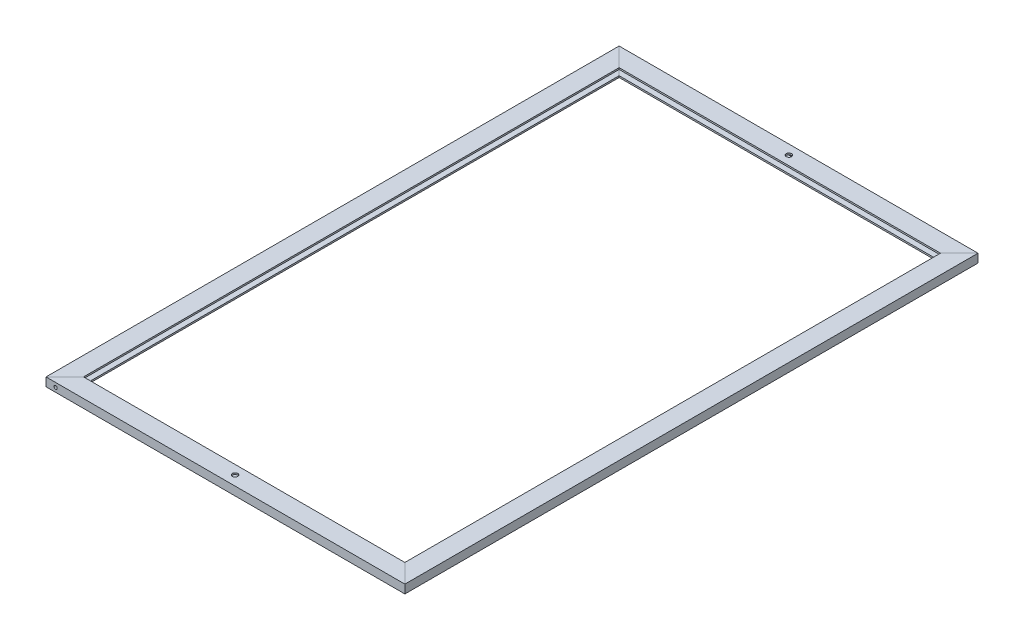
ISO-10303-21;
HEADER;
FILE_DESCRIPTION(('STEP AP214'),'2;1');
FILE_NAME('part.step','',(''),(''),'','','');
FILE_SCHEMA(('AUTOMOTIVE_DESIGN { 1 0 10303 214 1 1 1 1 }'));
ENDSEC;
DATA;
#1=APPLICATION_CONTEXT('core data for automotive mechanical design processes');
#2=APPLICATION_PROTOCOL_DEFINITION('international standard','automotive_design',2000,#1);
#3=PRODUCT_CONTEXT('',#1,'mechanical');
#4=PRODUCT('Part','Part','',(#3));
#5=PRODUCT_RELATED_PRODUCT_CATEGORY('part','',(#4));
#6=PRODUCT_DEFINITION_FORMATION('','',#4);
#7=PRODUCT_DEFINITION_CONTEXT('part definition',#1,'design');
#8=PRODUCT_DEFINITION('design','',#6,#7);
#9=PRODUCT_DEFINITION_SHAPE('','',#8);
#10=(LENGTH_UNIT() NAMED_UNIT(*) SI_UNIT(.MILLI.,.METRE.));
#11=(NAMED_UNIT(*) PLANE_ANGLE_UNIT() SI_UNIT($,.RADIAN.));
#12=(NAMED_UNIT(*) SI_UNIT($,.STERADIAN.) SOLID_ANGLE_UNIT());
#13=UNCERTAINTY_MEASURE_WITH_UNIT(LENGTH_MEASURE(1.E-05),#10,'distance_accuracy_value','');
#14=(GEOMETRIC_REPRESENTATION_CONTEXT(3) GLOBAL_UNCERTAINTY_ASSIGNED_CONTEXT((#13)) GLOBAL_UNIT_ASSIGNED_CONTEXT((#10,
#11,#12)) REPRESENTATION_CONTEXT('',''));
#15=CARTESIAN_POINT('',(0.,0.,0.));
#16=DIRECTION('',(0.,0.,1.));
#17=DIRECTION('',(1.,0.,0.));
#18=AXIS2_PLACEMENT_3D('',#15,#16,#17);
#19=CARTESIAN_POINT('',(630.,-3.,-1038.6));
#20=DIRECTION('',(0.,1.,0.));
#21=DIRECTION('',(-1.,0.,0.));
#22=AXIS2_PLACEMENT_3D('',#19,#20,#21);
#23=PLANE('',#22);
#24=DIRECTION('',(0.,0.,1.));
#25=VECTOR('',#24,1.);
#26=CARTESIAN_POINT('',(600.,-3.,-1038.6));
#27=LINE('',#26,#25);
#28=CARTESIAN_POINT('',(600.,-3.,-1000.));
#29=VERTEX_POINT('',#28);
#30=CARTESIAN_POINT('',(600.,-3.,0.));
#31=VERTEX_POINT('',#30);
#32=EDGE_CURVE('E41',#29,#31,#27,.T.);
#33=ORIENTED_EDGE('',*,*,#32,.F.);
#34=DIRECTION('',(0.707106781186548,0.,-0.707106781186548));
#35=VECTOR('',#34,1.);
#36=CARTESIAN_POINT('',(295.7,-3.00000000000001,-695.7));
#37=LINE('',#36,#35);
#38=CARTESIAN_POINT('',(630.,-3.,-1030.));
#39=VERTEX_POINT('',#38);
#40=EDGE_CURVE('E207',#29,#39,#37,.T.);
#41=ORIENTED_EDGE('',*,*,#40,.T.);
#42=DIRECTION('',(0.,0.,1.));
#43=VECTOR('',#42,1.);
#44=CARTESIAN_POINT('',(630.,-3.,-1038.6));
#45=LINE('',#44,#43);
#46=CARTESIAN_POINT('',(630.,-3.,30.));
#47=VERTEX_POINT('',#46);
#48=EDGE_CURVE('E141',#39,#47,#45,.T.);
#49=ORIENTED_EDGE('',*,*,#48,.T.);
#50=DIRECTION('',(0.707106781186548,0.,0.707106781186548));
#51=VECTOR('',#50,1.);
#52=CARTESIAN_POINT('',(634.3,-3.,34.2999999999999));
#53=LINE('',#52,#51);
#54=EDGE_CURVE('E128',#31,#47,#53,.T.);
#55=ORIENTED_EDGE('',*,*,#54,.F.);
#56=EDGE_LOOP('',(#33,#41,#49,#55));
#57=FACE_BOUND('',#56,.T.);
#58=ADVANCED_FACE('F38',(#57),#23,.F.);
#59=CARTESIAN_POINT('',(630.,-13.,-1038.6));
#60=DIRECTION('',(1.,0.,0.));
#61=DIRECTION('',(0.,0.,-1.));
#62=AXIS2_PLACEMENT_3D('',#59,#60,#61);
#63=PLANE('',#62);
#64=ORIENTED_EDGE('',*,*,#48,.F.);
#65=DIRECTION('',(0.,-1.,0.));
#66=VECTOR('',#65,1.);
#67=CARTESIAN_POINT('',(630.,-13.,-1030.));
#68=LINE('',#67,#66);
#69=CARTESIAN_POINT('',(630.,-13.,-1030.));
#70=VERTEX_POINT('',#69);
#71=EDGE_CURVE('E272',#39,#70,#68,.T.);
#72=ORIENTED_EDGE('',*,*,#71,.T.);
#73=DIRECTION('',(0.,0.,1.));
#74=VECTOR('',#73,1.);
#75=CARTESIAN_POINT('',(630.,-13.,-1038.6));
#76=LINE('',#75,#74);
#77=CARTESIAN_POINT('',(630.,-13.,29.9999999999998));
#78=VERTEX_POINT('',#77);
#79=EDGE_CURVE('E161',#70,#78,#76,.T.);
#80=ORIENTED_EDGE('',*,*,#79,.T.);
#81=DIRECTION('',(0.,-1.,0.));
#82=VECTOR('',#81,1.);
#83=CARTESIAN_POINT('',(630.,-13.,29.9999999999999));
#84=LINE('',#83,#82);
#85=EDGE_CURVE('E145',#47,#78,#84,.T.);
#86=ORIENTED_EDGE('',*,*,#85,.F.);
#87=EDGE_LOOP('',(#64,#72,#80,#86));
#88=FACE_BOUND('',#87,.T.);
#89=ADVANCED_FACE('F391',(#88),#63,.F.);
#90=CARTESIAN_POINT('',(600.,-13.,-1038.6));
#91=DIRECTION('',(0.,-1.,0.));
#92=DIRECTION('',(1.,0.,0.));
#93=AXIS2_PLACEMENT_3D('',#90,#91,#92);
#94=PLANE('',#93);
#95=ORIENTED_EDGE('',*,*,#79,.F.);
#96=DIRECTION('',(-0.707106781186548,0.,0.707106781186548));
#97=VECTOR('',#96,1.);
#98=CARTESIAN_POINT('',(280.7,-13.,-680.7));
#99=LINE('',#98,#97);
#100=CARTESIAN_POINT('',(600.,-13.,-1000.));
#101=VERTEX_POINT('',#100);
#102=EDGE_CURVE('E269',#70,#101,#99,.T.);
#103=ORIENTED_EDGE('',*,*,#102,.T.);
#104=DIRECTION('',(0.,0.,1.));
#105=VECTOR('',#104,1.);
#106=CARTESIAN_POINT('',(600.,-13.,-1038.6));
#107=LINE('',#106,#105);
#108=CARTESIAN_POINT('',(600.,-13.,0.));
#109=VERTEX_POINT('',#108);
#110=EDGE_CURVE('E165',#101,#109,#107,.T.);
#111=ORIENTED_EDGE('',*,*,#110,.T.);
#112=DIRECTION('',(-0.707106781186548,0.,-0.707106781186548));
#113=VECTOR('',#112,1.);
#114=CARTESIAN_POINT('',(619.3,-13.,19.2999999999999));
#115=LINE('',#114,#113);
#116=EDGE_CURVE('E215',#78,#109,#115,.T.);
#117=ORIENTED_EDGE('',*,*,#116,.F.);
#118=EDGE_LOOP('',(#95,#103,#111,#117));
#119=FACE_BOUND('',#118,.T.);
#120=ADVANCED_FACE('F389',(#119),#94,.F.);
#121=CARTESIAN_POINT('',(600.,-16.,-1038.6));
#122=DIRECTION('',(1.,0.,0.));
#123=DIRECTION('',(0.,1.,0.));
#124=AXIS2_PLACEMENT_3D('',#121,#122,#123);
#125=PLANE('',#124);
#126=ORIENTED_EDGE('',*,*,#110,.F.);
#127=DIRECTION('',(0.,-1.,0.));
#128=VECTOR('',#127,1.);
#129=CARTESIAN_POINT('',(600.,-16.,-1000.));
#130=LINE('',#129,#128);
#131=CARTESIAN_POINT('',(600.,-16.,-1000.));
#132=VERTEX_POINT('',#131);
#133=EDGE_CURVE('E266',#101,#132,#130,.T.);
#134=ORIENTED_EDGE('',*,*,#133,.T.);
#135=DIRECTION('',(0.,0.,1.));
#136=VECTOR('',#135,1.);
#137=CARTESIAN_POINT('',(600.,-16.,-1038.6));
#138=LINE('',#137,#136);
#139=CARTESIAN_POINT('',(600.,-16.,-1.35308431126191E-13));
#140=VERTEX_POINT('',#139);
#141=EDGE_CURVE('E168',#132,#140,#138,.T.);
#142=ORIENTED_EDGE('',*,*,#141,.T.);
#143=DIRECTION('',(0.,-1.,0.));
#144=VECTOR('',#143,1.);
#145=CARTESIAN_POINT('',(600.,-16.,-1.11022302462516E-13));
#146=LINE('',#145,#144);
#147=EDGE_CURVE('E213',#109,#140,#146,.T.);
#148=ORIENTED_EDGE('',*,*,#147,.F.);
#149=EDGE_LOOP('',(#126,#134,#142,#148));
#150=FACE_BOUND('',#149,.T.);
#151=ADVANCED_FACE('F397',(#150),#125,.F.);
#152=CARTESIAN_POINT('',(635.,-16.,-1038.6));
#153=DIRECTION('',(0.,1.,0.));
#154=DIRECTION('',(0.,0.,1.));
#155=AXIS2_PLACEMENT_3D('',#152,#153,#154);
#156=PLANE('',#155);
#157=ORIENTED_EDGE('',*,*,#141,.F.);
#158=DIRECTION('',(0.707106781186548,0.,-0.707106781186548));
#159=VECTOR('',#158,1.);
#160=CARTESIAN_POINT('',(298.2,-16.,-698.2));
#161=LINE('',#160,#159);
#162=CARTESIAN_POINT('',(635.,-16.,-1035.));
#163=VERTEX_POINT('',#162);
#164=EDGE_CURVE('E263',#132,#163,#161,.T.);
#165=ORIENTED_EDGE('',*,*,#164,.T.);
#166=DIRECTION('',(0.,0.,1.));
#167=VECTOR('',#166,1.);
#168=CARTESIAN_POINT('',(635.,-16.,-1038.6));
#169=LINE('',#168,#167);
#170=CARTESIAN_POINT('',(635.,-16.,34.9999999999999));
#171=VERTEX_POINT('',#170);
#172=EDGE_CURVE('E171',#163,#171,#169,.T.);
#173=ORIENTED_EDGE('',*,*,#172,.T.);
#174=DIRECTION('',(0.707106781186548,0.,0.707106781186548));
#175=VECTOR('',#174,1.);
#176=CARTESIAN_POINT('',(636.8,-16.,36.7999999999999));
#177=LINE('',#176,#175);
#178=EDGE_CURVE('E211',#140,#171,#177,.T.);
#179=ORIENTED_EDGE('',*,*,#178,.F.);
#180=EDGE_LOOP('',(#157,#165,#173,#179));
#181=FACE_BOUND('',#180,.T.);
#182=ADVANCED_FACE('F472',(#181),#156,.F.);
#183=CARTESIAN_POINT('',(635.,0.,-1038.6));
#184=DIRECTION('',(-1.,0.,0.));
#185=DIRECTION('',(0.,0.,1.));
#186=AXIS2_PLACEMENT_3D('',#183,#184,#185);
#187=PLANE('',#186);
#188=ORIENTED_EDGE('',*,*,#172,.F.);
#189=DIRECTION('',(0.,1.,0.));
#190=VECTOR('',#189,1.);
#191=CARTESIAN_POINT('',(635.,0.,-1035.));
#192=LINE('',#191,#190);
#193=CARTESIAN_POINT('',(635.,0.,-1035.));
#194=VERTEX_POINT('',#193);
#195=EDGE_CURVE('E188',#163,#194,#192,.T.);
#196=ORIENTED_EDGE('',*,*,#195,.T.);
#197=DIRECTION('',(0.,0.,1.));
#198=VECTOR('',#197,1.);
#199=CARTESIAN_POINT('',(635.,0.,-1038.6));
#200=LINE('',#199,#198);
#201=CARTESIAN_POINT('',(635.,0.,34.9999999999998));
#202=VERTEX_POINT('',#201);
#203=EDGE_CURVE('E174',#194,#202,#200,.T.);
#204=ORIENTED_EDGE('',*,*,#203,.T.);
#205=DIRECTION('',(0.,1.,0.));
#206=VECTOR('',#205,1.);
#207=CARTESIAN_POINT('',(635.,0.,34.9999999999999));
#208=LINE('',#207,#206);
#209=EDGE_CURVE('E110',#171,#202,#208,.T.);
#210=ORIENTED_EDGE('',*,*,#209,.F.);
#211=EDGE_LOOP('',(#188,#196,#204,#210));
#212=FACE_BOUND('',#211,.T.);
#213=ADVANCED_FACE('F469',(#212),#187,.F.);
#214=CARTESIAN_POINT('',(600.,0.,-1038.6));
#215=DIRECTION('',(0.,-1.,0.));
#216=DIRECTION('',(1.,0.,0.));
#217=AXIS2_PLACEMENT_3D('',#214,#215,#216);
#218=PLANE('',#217);
#219=ORIENTED_EDGE('',*,*,#203,.F.);
#220=DIRECTION('',(-0.707106781186548,0.,0.707106781186548));
#221=VECTOR('',#220,1.);
#222=CARTESIAN_POINT('',(280.7,0.,-680.7));
#223=LINE('',#222,#221);
#224=CARTESIAN_POINT('',(600.,0.,-1000.));
#225=VERTEX_POINT('',#224);
#226=EDGE_CURVE('E183',#194,#225,#223,.T.);
#227=ORIENTED_EDGE('',*,*,#226,.T.);
#228=DIRECTION('',(0.,0.,1.));
#229=VECTOR('',#228,1.);
#230=CARTESIAN_POINT('',(600.,0.,-1038.6));
#231=LINE('',#230,#229);
#232=CARTESIAN_POINT('',(600.,0.,0.));
#233=VERTEX_POINT('',#232);
#234=EDGE_CURVE('E138',#225,#233,#231,.T.);
#235=ORIENTED_EDGE('',*,*,#234,.T.);
#236=DIRECTION('',(-0.707106781186548,0.,-0.707106781186548));
#237=VECTOR('',#236,1.);
#238=CARTESIAN_POINT('',(619.3,0.,19.2999999999999));
#239=LINE('',#238,#237);
#240=EDGE_CURVE('E181',#202,#233,#239,.T.);
#241=ORIENTED_EDGE('',*,*,#240,.F.);
#242=EDGE_LOOP('',(#219,#227,#235,#241));
#243=FACE_BOUND('',#242,.T.);
#244=ADVANCED_FACE('F180',(#243),#218,.F.);
#245=CARTESIAN_POINT('',(600.,-3.,-1038.6));
#246=DIRECTION('',(1.,0.,0.));
#247=DIRECTION('',(0.,0.,-1.));
#248=AXIS2_PLACEMENT_3D('',#245,#246,#247);
#249=PLANE('',#248);
#250=ORIENTED_EDGE('',*,*,#234,.F.);
#251=DIRECTION('',(0.,-1.,0.));
#252=VECTOR('',#251,1.);
#253=CARTESIAN_POINT('',(600.,-3.,-1000.));
#254=LINE('',#253,#252);
#255=EDGE_CURVE('E134',#225,#29,#254,.T.);
#256=ORIENTED_EDGE('',*,*,#255,.T.);
#257=ORIENTED_EDGE('',*,*,#32,.T.);
#258=DIRECTION('',(0.,-1.,0.));
#259=VECTOR('',#258,1.);
#260=CARTESIAN_POINT('',(600.,-3.,-1.11022302462516E-13));
#261=LINE('',#260,#259);
#262=EDGE_CURVE('E117',#233,#31,#261,.T.);
#263=ORIENTED_EDGE('',*,*,#262,.F.);
#264=EDGE_LOOP('',(#250,#256,#257,#263));
#265=FACE_BOUND('',#264,.T.);
#266=ADVANCED_FACE('F133',(#265),#249,.F.);
#267=CARTESIAN_POINT('',(638.6,-3.,29.9999999999999));
#268=DIRECTION('',(0.,1.,0.));
#269=DIRECTION('',(0.,0.,1.));
#270=AXIS2_PLACEMENT_3D('',#267,#268,#269);
#271=PLANE('',#270);
#272=CARTESIAN_POINT('',(300.,-3.,16.9999999999999));
#273=DIRECTION('',(0.,1.,0.));
#274=DIRECTION('',(0.,0.,1.));
#275=AXIS2_PLACEMENT_3D('',#272,#273,#274);
#276=CIRCLE('',#275,4.99999999999999);
#277=CARTESIAN_POINT('',(300.,-3.,21.9999999999999));
#278=VERTEX_POINT('',#277);
#279=EDGE_CURVE('E503',#278,#278,#276,.T.);
#280=ORIENTED_EDGE('',*,*,#279,.T.);
#281=EDGE_LOOP('',(#280));
#282=FACE_BOUND('',#281,.T.);
#283=DIRECTION('',(-1.,0.,0.));
#284=VECTOR('',#283,1.);
#285=CARTESIAN_POINT('',(638.6,-3.,-1.11022302462516E-13));
#286=LINE('',#285,#284);
#287=CARTESIAN_POINT('',(0.,-3.,0.));
#288=VERTEX_POINT('',#287);
#289=EDGE_CURVE('E122',#31,#288,#286,.T.);
#290=ORIENTED_EDGE('',*,*,#289,.F.);
#291=ORIENTED_EDGE('',*,*,#54,.T.);
#292=DIRECTION('',(-1.,0.,0.));
#293=VECTOR('',#292,1.);
#294=CARTESIAN_POINT('',(638.6,-3.,29.9999999999999));
#295=LINE('',#294,#293);
#296=CARTESIAN_POINT('',(-30.,-3.,29.9999999999999));
#297=VERTEX_POINT('',#296);
#298=EDGE_CURVE('E209',#47,#297,#295,.T.);
#299=ORIENTED_EDGE('',*,*,#298,.T.);
#300=DIRECTION('',(-0.707106781186548,0.,0.707106781186548));
#301=VECTOR('',#300,1.);
#302=CARTESIAN_POINT('',(-34.3,-3.,34.3));
#303=LINE('',#302,#301);
#304=EDGE_CURVE('E149',#288,#297,#303,.T.);
#305=ORIENTED_EDGE('',*,*,#304,.F.);
#306=EDGE_LOOP('',(#290,#291,#299,#305));
#307=FACE_BOUND('',#306,.T.);
#308=ADVANCED_FACE('F147',(#282,#307),#271,.F.);
#309=CARTESIAN_POINT('',(638.6,-13.,29.9999999999999));
#310=DIRECTION('',(0.,0.,1.));
#311=DIRECTION('',(1.,0.,0.));
#312=AXIS2_PLACEMENT_3D('',#309,#310,#311);
#313=PLANE('',#312);
#314=CARTESIAN_POINT('',(-17.,-8.,29.9999999999998));
#315=DIRECTION('',(0.,0.,1.));
#316=DIRECTION('',(1.,0.,0.));
#317=AXIS2_PLACEMENT_3D('',#314,#315,#316);
#318=CIRCLE('',#317,3.);
#319=CARTESIAN_POINT('',(-14.,-8.,29.9999999999998));
#320=VERTEX_POINT('',#319);
#321=EDGE_CURVE('E162',#320,#320,#318,.T.);
#322=ORIENTED_EDGE('',*,*,#321,.T.);
#323=EDGE_LOOP('',(#322));
#324=FACE_BOUND('',#323,.T.);
#325=ORIENTED_EDGE('',*,*,#298,.F.);
#326=ORIENTED_EDGE('',*,*,#85,.T.);
#327=DIRECTION('',(-1.,0.,0.));
#328=VECTOR('',#327,1.);
#329=CARTESIAN_POINT('',(638.6,-13.,29.9999999999999));
#330=LINE('',#329,#328);
#331=CARTESIAN_POINT('',(-29.9999999999999,-13.,29.9999999999999));
#332=VERTEX_POINT('',#331);
#333=EDGE_CURVE('E219',#78,#332,#330,.T.);
#334=ORIENTED_EDGE('',*,*,#333,.T.);
#335=DIRECTION('',(0.,-1.,0.));
#336=VECTOR('',#335,1.);
#337=CARTESIAN_POINT('',(-30.,-13.,30.));
#338=LINE('',#337,#336);
#339=EDGE_CURVE('E368',#297,#332,#338,.T.);
#340=ORIENTED_EDGE('',*,*,#339,.F.);
#341=EDGE_LOOP('',(#325,#326,#334,#340));
#342=FACE_BOUND('',#341,.T.);
#343=ADVANCED_FACE('F374',(#324,#342),#313,.F.);
#344=CARTESIAN_POINT('',(638.6,-13.,-1.11022302462516E-13));
#345=DIRECTION('',(0.,-1.,0.));
#346=DIRECTION('',(0.,0.,-1.));
#347=AXIS2_PLACEMENT_3D('',#344,#345,#346);
#348=PLANE('',#347);
#349=CARTESIAN_POINT('',(300.,-13.,16.9999999999999));
#350=DIRECTION('',(0.,-1.,0.));
#351=DIRECTION('',(0.,0.,-1.));
#352=AXIS2_PLACEMENT_3D('',#349,#350,#351);
#353=CIRCLE('',#352,4.99999999999999);
#354=CARTESIAN_POINT('',(300.,-13.,11.9999999999999));
#355=VERTEX_POINT('',#354);
#356=EDGE_CURVE('E508',#355,#355,#353,.T.);
#357=ORIENTED_EDGE('',*,*,#356,.T.);
#358=EDGE_LOOP('',(#357));
#359=FACE_BOUND('',#358,.T.);
#360=ORIENTED_EDGE('',*,*,#333,.F.);
#361=ORIENTED_EDGE('',*,*,#116,.T.);
#362=DIRECTION('',(-1.,0.,0.));
#363=VECTOR('',#362,1.);
#364=CARTESIAN_POINT('',(638.6,-13.,-1.11022302462516E-13));
#365=LINE('',#364,#363);
#366=CARTESIAN_POINT('',(0.,-13.,0.));
#367=VERTEX_POINT('',#366);
#368=EDGE_CURVE('E222',#109,#367,#365,.T.);
#369=ORIENTED_EDGE('',*,*,#368,.T.);
#370=DIRECTION('',(0.707106781186548,0.,-0.707106781186548));
#371=VECTOR('',#370,1.);
#372=CARTESIAN_POINT('',(-19.3,-13.,19.3));
#373=LINE('',#372,#371);
#374=EDGE_CURVE('E371',#332,#367,#373,.T.);
#375=ORIENTED_EDGE('',*,*,#374,.F.);
#376=EDGE_LOOP('',(#360,#361,#369,#375));
#377=FACE_BOUND('',#376,.T.);
#378=ADVANCED_FACE('F376',(#359,#377),#348,.F.);
#379=CARTESIAN_POINT('',(638.6,-16.,-1.11022302462516E-13));
#380=DIRECTION('',(0.,0.,1.));
#381=DIRECTION('',(0.,-1.,0.));
#382=AXIS2_PLACEMENT_3D('',#379,#380,#381);
#383=PLANE('',#382);
#384=ORIENTED_EDGE('',*,*,#368,.F.);
#385=ORIENTED_EDGE('',*,*,#147,.T.);
#386=DIRECTION('',(-1.,0.,0.));
#387=VECTOR('',#386,1.);
#388=CARTESIAN_POINT('',(638.6,-16.,-1.11022302462516E-13));
#389=LINE('',#388,#387);
#390=CARTESIAN_POINT('',(0.,-16.,0.));
#391=VERTEX_POINT('',#390);
#392=EDGE_CURVE('E225',#140,#391,#389,.T.);
#393=ORIENTED_EDGE('',*,*,#392,.T.);
#394=DIRECTION('',(0.,-1.,0.));
#395=VECTOR('',#394,1.);
#396=CARTESIAN_POINT('',(0.,-16.,0.));
#397=LINE('',#396,#395);
#398=EDGE_CURVE('E354',#367,#391,#397,.T.);
#399=ORIENTED_EDGE('',*,*,#398,.F.);
#400=EDGE_LOOP('',(#384,#385,#393,#399));
#401=FACE_BOUND('',#400,.T.);
#402=ADVANCED_FACE('F451',(#401),#383,.F.);
#403=CARTESIAN_POINT('',(638.6,-16.,34.9999999999999));
#404=DIRECTION('',(0.,1.,0.));
#405=DIRECTION('',(0.,0.,1.));
#406=AXIS2_PLACEMENT_3D('',#403,#404,#405);
#407=PLANE('',#406);
#408=CARTESIAN_POINT('',(300.,-16.,16.9999999999999));
#409=DIRECTION('',(0.,1.,0.));
#410=DIRECTION('',(0.,0.,-1.));
#411=AXIS2_PLACEMENT_3D('',#408,#409,#410);
#412=CIRCLE('',#411,4.99999999999999);
#413=CARTESIAN_POINT('',(300.,-16.,11.9999999999999));
#414=VERTEX_POINT('',#413);
#415=EDGE_CURVE('E521',#414,#414,#412,.T.);
#416=ORIENTED_EDGE('',*,*,#415,.T.);
#417=EDGE_LOOP('',(#416));
#418=FACE_BOUND('',#417,.T.);
#419=ORIENTED_EDGE('',*,*,#392,.F.);
#420=ORIENTED_EDGE('',*,*,#178,.T.);
#421=DIRECTION('',(-1.,0.,0.));
#422=VECTOR('',#421,1.);
#423=CARTESIAN_POINT('',(638.6,-16.,34.9999999999999));
#424=LINE('',#423,#422);
#425=CARTESIAN_POINT('',(-35.,-16.,35.));
#426=VERTEX_POINT('',#425);
#427=EDGE_CURVE('E228',#171,#426,#424,.T.);
#428=ORIENTED_EDGE('',*,*,#427,.T.);
#429=DIRECTION('',(-0.707106781186548,0.,0.707106781186548));
#430=VECTOR('',#429,1.);
#431=CARTESIAN_POINT('',(-36.8,-16.,36.8));
#432=LINE('',#431,#430);
#433=EDGE_CURVE('E359',#391,#426,#432,.T.);
#434=ORIENTED_EDGE('',*,*,#433,.F.);
#435=EDGE_LOOP('',(#419,#420,#428,#434));
#436=FACE_BOUND('',#435,.T.);
#437=ADVANCED_FACE('F447',(#418,#436),#407,.F.);
#438=CARTESIAN_POINT('',(638.6,0.,34.9999999999999));
#439=DIRECTION('',(0.,0.,-1.));
#440=DIRECTION('',(-1.,0.,0.));
#441=AXIS2_PLACEMENT_3D('',#438,#439,#440);
#442=PLANE('',#441);
#443=CARTESIAN_POINT('',(-17.,-8.,34.9999999999999));
#444=DIRECTION('',(0.,0.,1.));
#445=DIRECTION('',(1.,0.,0.));
#446=AXIS2_PLACEMENT_3D('',#443,#444,#445);
#447=CIRCLE('',#446,3.);
#448=CARTESIAN_POINT('',(-14.,-8.,34.9999999999999));
#449=VERTEX_POINT('',#448);
#450=EDGE_CURVE('E500',#449,#449,#447,.T.);
#451=ORIENTED_EDGE('',*,*,#450,.F.);
#452=EDGE_LOOP('',(#451));
#453=FACE_BOUND('',#452,.T.);
#454=ORIENTED_EDGE('',*,*,#427,.F.);
#455=ORIENTED_EDGE('',*,*,#209,.T.);
#456=DIRECTION('',(-1.,0.,0.));
#457=VECTOR('',#456,1.);
#458=CARTESIAN_POINT('',(638.6,0.,34.9999999999999));
#459=LINE('',#458,#457);
#460=CARTESIAN_POINT('',(-34.9999999999999,0.,34.9999999999999));
#461=VERTEX_POINT('',#460);
#462=EDGE_CURVE('E156',#202,#461,#459,.T.);
#463=ORIENTED_EDGE('',*,*,#462,.T.);
#464=DIRECTION('',(0.,1.,0.));
#465=VECTOR('',#464,1.);
#466=CARTESIAN_POINT('',(-35.,0.,35.));
#467=LINE('',#466,#465);
#468=EDGE_CURVE('E236',#426,#461,#467,.T.);
#469=ORIENTED_EDGE('',*,*,#468,.F.);
#470=EDGE_LOOP('',(#454,#455,#463,#469));
#471=FACE_BOUND('',#470,.T.);
#472=ADVANCED_FACE('F233',(#453,#471),#442,.F.);
#473=CARTESIAN_POINT('',(638.6,0.,-1.11022302462516E-13));
#474=DIRECTION('',(0.,-1.,0.));
#475=DIRECTION('',(0.,0.,-1.));
#476=AXIS2_PLACEMENT_3D('',#473,#474,#475);
#477=PLANE('',#476);
#478=CARTESIAN_POINT('',(300.,0.,16.9999999999999));
#479=DIRECTION('',(0.,1.,0.));
#480=DIRECTION('',(0.,0.,-1.));
#481=AXIS2_PLACEMENT_3D('',#478,#479,#480);
#482=CIRCLE('',#481,4.99999999999999);
#483=CARTESIAN_POINT('',(300.,0.,11.9999999999999));
#484=VERTEX_POINT('',#483);
#485=EDGE_CURVE('E518',#484,#484,#482,.T.);
#486=ORIENTED_EDGE('',*,*,#485,.F.);
#487=EDGE_LOOP('',(#486));
#488=FACE_BOUND('',#487,.T.);
#489=ORIENTED_EDGE('',*,*,#462,.F.);
#490=ORIENTED_EDGE('',*,*,#240,.T.);
#491=DIRECTION('',(-1.,0.,0.));
#492=VECTOR('',#491,1.);
#493=CARTESIAN_POINT('',(638.6,0.,-1.11022302462516E-13));
#494=LINE('',#493,#492);
#495=CARTESIAN_POINT('',(0.,0.,0.));
#496=VERTEX_POINT('',#495);
#497=EDGE_CURVE('E125',#233,#496,#494,.T.);
#498=ORIENTED_EDGE('',*,*,#497,.T.);
#499=DIRECTION('',(0.707106781186548,0.,-0.707106781186548));
#500=VECTOR('',#499,1.);
#501=CARTESIAN_POINT('',(-19.3,0.,19.3));
#502=LINE('',#501,#500);
#503=EDGE_CURVE('E242',#461,#496,#502,.T.);
#504=ORIENTED_EDGE('',*,*,#503,.F.);
#505=EDGE_LOOP('',(#489,#490,#498,#504));
#506=FACE_BOUND('',#505,.T.);
#507=ADVANCED_FACE('F244',(#488,#506),#477,.F.);
#508=CARTESIAN_POINT('',(638.6,-3.,-1.11022302462516E-13));
#509=DIRECTION('',(0.,0.,1.));
#510=DIRECTION('',(1.,0.,0.));
#511=AXIS2_PLACEMENT_3D('',#508,#509,#510);
#512=PLANE('',#511);
#513=ORIENTED_EDGE('',*,*,#497,.F.);
#514=ORIENTED_EDGE('',*,*,#262,.T.);
#515=ORIENTED_EDGE('',*,*,#289,.T.);
#516=DIRECTION('',(0.,-1.,0.));
#517=VECTOR('',#516,1.);
#518=CARTESIAN_POINT('',(0.,-3.,0.));
#519=LINE('',#518,#517);
#520=EDGE_CURVE('E246',#496,#288,#519,.T.);
#521=ORIENTED_EDGE('',*,*,#520,.F.);
#522=EDGE_LOOP('',(#513,#514,#515,#521));
#523=FACE_BOUND('',#522,.T.);
#524=ADVANCED_FACE('F119',(#523),#512,.F.);
#525=CARTESIAN_POINT('',(-38.5999999999999,-3.,-1030.));
#526=DIRECTION('',(0.,1.,0.));
#527=DIRECTION('',(0.,0.,1.));
#528=AXIS2_PLACEMENT_3D('',#525,#526,#527);
#529=PLANE('',#528);
#530=CARTESIAN_POINT('',(300.,-3.,-1017.));
#531=DIRECTION('',(0.,1.,0.));
#532=DIRECTION('',(0.,0.,1.));
#533=AXIS2_PLACEMENT_3D('',#530,#531,#532);
#534=CIRCLE('',#533,4.99999999999999);
#535=CARTESIAN_POINT('',(300.,-3.,-1012.));
#536=VERTEX_POINT('',#535);
#537=EDGE_CURVE('E511',#536,#536,#534,.T.);
#538=ORIENTED_EDGE('',*,*,#537,.T.);
#539=EDGE_LOOP('',(#538));
#540=FACE_BOUND('',#539,.T.);
#541=DIRECTION('',(1.,0.,0.));
#542=VECTOR('',#541,1.);
#543=CARTESIAN_POINT('',(-38.5999999999999,-3.,-1000.));
#544=LINE('',#543,#542);
#545=CARTESIAN_POINT('',(0.,-3.,-1000.));
#546=VERTEX_POINT('',#545);
#547=EDGE_CURVE('E197',#546,#29,#544,.T.);
#548=ORIENTED_EDGE('',*,*,#547,.F.);
#549=DIRECTION('',(-0.707106781186548,0.,-0.707106781186548));
#550=VECTOR('',#549,1.);
#551=CARTESIAN_POINT('',(504.3,-3.00000000000001,-495.7));
#552=LINE('',#551,#550);
#553=CARTESIAN_POINT('',(-30.,-3.,-1030.));
#554=VERTEX_POINT('',#553);
#555=EDGE_CURVE('E324',#546,#554,#552,.T.);
#556=ORIENTED_EDGE('',*,*,#555,.T.);
#557=DIRECTION('',(1.,0.,0.));
#558=VECTOR('',#557,1.);
#559=CARTESIAN_POINT('',(-38.5999999999999,-3.,-1030.));
#560=LINE('',#559,#558);
#561=EDGE_CURVE('E151',#554,#39,#560,.T.);
#562=ORIENTED_EDGE('',*,*,#561,.T.);
#563=ORIENTED_EDGE('',*,*,#40,.F.);
#564=EDGE_LOOP('',(#548,#556,#562,#563));
#565=FACE_BOUND('',#564,.T.);
#566=ADVANCED_FACE('F331',(#540,#565),#529,.F.);
#567=CARTESIAN_POINT('',(-38.5999999999999,-13.,-1030.));
#568=DIRECTION('',(0.,0.,-1.));
#569=DIRECTION('',(-1.,0.,0.));
#570=AXIS2_PLACEMENT_3D('',#567,#568,#569);
#571=PLANE('',#570);
#572=CARTESIAN_POINT('',(-17.,-8.,-1030.));
#573=DIRECTION('',(0.,0.,-1.));
#574=DIRECTION('',(-1.,0.,0.));
#575=AXIS2_PLACEMENT_3D('',#572,#573,#574);
#576=CIRCLE('',#575,3.);
#577=CARTESIAN_POINT('',(-20.,-8.,-1030.));
#578=VERTEX_POINT('',#577);
#579=EDGE_CURVE('E496',#578,#578,#576,.T.);
#580=ORIENTED_EDGE('',*,*,#579,.T.);
#581=EDGE_LOOP('',(#580));
#582=FACE_BOUND('',#581,.T.);
#583=ORIENTED_EDGE('',*,*,#561,.F.);
#584=DIRECTION('',(0.,-1.,0.));
#585=VECTOR('',#584,1.);
#586=CARTESIAN_POINT('',(-30.,-13.,-1030.));
#587=LINE('',#586,#585);
#588=CARTESIAN_POINT('',(-30.0000000000001,-13.,-1030.));
#589=VERTEX_POINT('',#588);
#590=EDGE_CURVE('E315',#554,#589,#587,.T.);
#591=ORIENTED_EDGE('',*,*,#590,.T.);
#592=DIRECTION('',(1.,0.,0.));
#593=VECTOR('',#592,1.);
#594=CARTESIAN_POINT('',(-38.5999999999999,-13.,-1030.));
#595=LINE('',#594,#593);
#596=EDGE_CURVE('E154',#589,#70,#595,.T.);
#597=ORIENTED_EDGE('',*,*,#596,.T.);
#598=ORIENTED_EDGE('',*,*,#71,.F.);
#599=EDGE_LOOP('',(#583,#591,#597,#598));
#600=FACE_BOUND('',#599,.T.);
#601=ADVANCED_FACE('F328',(#582,#600),#571,.F.);
#602=CARTESIAN_POINT('',(-38.5999999999999,-13.,-1000.));
#603=DIRECTION('',(0.,-1.,0.));
#604=DIRECTION('',(0.,0.,-1.));
#605=AXIS2_PLACEMENT_3D('',#602,#603,#604);
#606=PLANE('',#605);
#607=CARTESIAN_POINT('',(300.,-13.,-1017.));
#608=DIRECTION('',(0.,-1.,0.));
#609=DIRECTION('',(0.,0.,-1.));
#610=AXIS2_PLACEMENT_3D('',#607,#608,#609);
#611=CIRCLE('',#610,4.99999999999999);
#612=CARTESIAN_POINT('',(300.,-13.,-1022.));
#613=VERTEX_POINT('',#612);
#614=EDGE_CURVE('E514',#613,#613,#611,.T.);
#615=ORIENTED_EDGE('',*,*,#614,.T.);
#616=EDGE_LOOP('',(#615));
#617=FACE_BOUND('',#616,.T.);
#618=ORIENTED_EDGE('',*,*,#596,.F.);
#619=DIRECTION('',(0.707106781186548,0.,0.707106781186548));
#620=VECTOR('',#619,1.);
#621=CARTESIAN_POINT('',(519.3,-12.9999999999999,-480.7));
#622=LINE('',#621,#620);
#623=CARTESIAN_POINT('',(0.,-13.,-1000.));
#624=VERTEX_POINT('',#623);
#625=EDGE_CURVE('E325',#589,#624,#622,.T.);
#626=ORIENTED_EDGE('',*,*,#625,.T.);
#627=DIRECTION('',(1.,0.,0.));
#628=VECTOR('',#627,1.);
#629=CARTESIAN_POINT('',(-38.5999999999999,-13.,-1000.));
#630=LINE('',#629,#628);
#631=EDGE_CURVE('E278',#624,#101,#630,.T.);
#632=ORIENTED_EDGE('',*,*,#631,.T.);
#633=ORIENTED_EDGE('',*,*,#102,.F.);
#634=EDGE_LOOP('',(#618,#626,#632,#633));
#635=FACE_BOUND('',#634,.T.);
#636=ADVANCED_FACE('F385',(#617,#635),#606,.F.);
#637=CARTESIAN_POINT('',(-38.5999999999999,-16.,-1000.));
#638=DIRECTION('',(0.,0.,-1.));
#639=DIRECTION('',(0.,1.,0.));
#640=AXIS2_PLACEMENT_3D('',#637,#638,#639);
#641=PLANE('',#640);
#642=ORIENTED_EDGE('',*,*,#631,.F.);
#643=DIRECTION('',(0.,-1.,0.));
#644=VECTOR('',#643,1.);
#645=CARTESIAN_POINT('',(0.,-16.,-1000.));
#646=LINE('',#645,#644);
#647=CARTESIAN_POINT('',(0.,-16.,-1000.));
#648=VERTEX_POINT('',#647);
#649=EDGE_CURVE('E350',#624,#648,#646,.T.);
#650=ORIENTED_EDGE('',*,*,#649,.T.);
#651=DIRECTION('',(1.,0.,0.));
#652=VECTOR('',#651,1.);
#653=CARTESIAN_POINT('',(-38.5999999999999,-16.,-1000.));
#654=LINE('',#653,#652);
#655=EDGE_CURVE('E281',#648,#132,#654,.T.);
#656=ORIENTED_EDGE('',*,*,#655,.T.);
#657=ORIENTED_EDGE('',*,*,#133,.F.);
#658=EDGE_LOOP('',(#642,#650,#656,#657));
#659=FACE_BOUND('',#658,.T.);
#660=ADVANCED_FACE('F426',(#659),#641,.F.);
#661=CARTESIAN_POINT('',(-38.5999999999999,-16.,-1035.));
#662=DIRECTION('',(0.,1.,0.));
#663=DIRECTION('',(0.,0.,1.));
#664=AXIS2_PLACEMENT_3D('',#661,#662,#663);
#665=PLANE('',#664);
#666=CARTESIAN_POINT('',(300.,-16.0000000000001,-1017.));
#667=DIRECTION('',(0.,1.,0.));
#668=DIRECTION('',(0.,0.,1.));
#669=AXIS2_PLACEMENT_3D('',#666,#667,#668);
#670=CIRCLE('',#669,4.99999999999999);
#671=CARTESIAN_POINT('',(300.,-16.0000000000001,-1012.));
#672=VERTEX_POINT('',#671);
#673=EDGE_CURVE('E517',#672,#672,#670,.T.);
#674=ORIENTED_EDGE('',*,*,#673,.T.);
#675=EDGE_LOOP('',(#674));
#676=FACE_BOUND('',#675,.T.);
#677=ORIENTED_EDGE('',*,*,#655,.F.);
#678=DIRECTION('',(-0.707106781186548,0.,-0.707106781186548));
#679=VECTOR('',#678,1.);
#680=CARTESIAN_POINT('',(501.8,-16.,-498.2));
#681=LINE('',#680,#679);
#682=CARTESIAN_POINT('',(-35.,-16.,-1035.));
#683=VERTEX_POINT('',#682);
#684=EDGE_CURVE('E292',#648,#683,#681,.T.);
#685=ORIENTED_EDGE('',*,*,#684,.T.);
#686=DIRECTION('',(1.,0.,0.));
#687=VECTOR('',#686,1.);
#688=CARTESIAN_POINT('',(-38.5999999999999,-16.,-1035.));
#689=LINE('',#688,#687);
#690=EDGE_CURVE('E202',#683,#163,#689,.T.);
#691=ORIENTED_EDGE('',*,*,#690,.T.);
#692=ORIENTED_EDGE('',*,*,#164,.F.);
#693=EDGE_LOOP('',(#677,#685,#691,#692));
#694=FACE_BOUND('',#693,.T.);
#695=ADVANCED_FACE('F288',(#676,#694),#665,.F.);
#696=CARTESIAN_POINT('',(-38.5999999999999,0.,-1035.));
#697=DIRECTION('',(0.,0.,1.));
#698=DIRECTION('',(1.,0.,0.));
#699=AXIS2_PLACEMENT_3D('',#696,#697,#698);
#700=PLANE('',#699);
#701=CARTESIAN_POINT('',(-17.,-8.,-1035.));
#702=DIRECTION('',(0.,0.,1.));
#703=DIRECTION('',(1.,0.,0.));
#704=AXIS2_PLACEMENT_3D('',#701,#702,#703);
#705=CIRCLE('',#704,3.);
#706=CARTESIAN_POINT('',(-14.,-8.,-1035.));
#707=VERTEX_POINT('',#706);
#708=EDGE_CURVE('E499',#707,#707,#705,.T.);
#709=ORIENTED_EDGE('',*,*,#708,.T.);
#710=EDGE_LOOP('',(#709));
#711=FACE_BOUND('',#710,.T.);
#712=ORIENTED_EDGE('',*,*,#690,.F.);
#713=DIRECTION('',(0.,1.,0.));
#714=VECTOR('',#713,1.);
#715=CARTESIAN_POINT('',(-35.,0.,-1035.));
#716=LINE('',#715,#714);
#717=CARTESIAN_POINT('',(-35.,0.,-1035.));
#718=VERTEX_POINT('',#717);
#719=EDGE_CURVE('E296',#683,#718,#716,.T.);
#720=ORIENTED_EDGE('',*,*,#719,.T.);
#721=DIRECTION('',(1.,0.,0.));
#722=VECTOR('',#721,1.);
#723=CARTESIAN_POINT('',(-38.5999999999999,0.,-1035.));
#724=LINE('',#723,#722);
#725=EDGE_CURVE('E198',#718,#194,#724,.T.);
#726=ORIENTED_EDGE('',*,*,#725,.T.);
#727=ORIENTED_EDGE('',*,*,#195,.F.);
#728=EDGE_LOOP('',(#712,#720,#726,#727));
#729=FACE_BOUND('',#728,.T.);
#730=ADVANCED_FACE('F295',(#711,#729),#700,.F.);
#731=CARTESIAN_POINT('',(-38.5999999999999,0.,-1000.));
#732=DIRECTION('',(0.,-1.,0.));
#733=DIRECTION('',(0.,0.,-1.));
#734=AXIS2_PLACEMENT_3D('',#731,#732,#733);
#735=PLANE('',#734);
#736=CARTESIAN_POINT('',(300.,-1.24546579473286E-13,-1017.));
#737=DIRECTION('',(0.,1.,0.));
#738=DIRECTION('',(0.,0.,1.));
#739=AXIS2_PLACEMENT_3D('',#736,#737,#738);
#740=CIRCLE('',#739,4.99999999999999);
#741=CARTESIAN_POINT('',(300.,-1.23934256073712E-13,-1012.));
#742=VERTEX_POINT('',#741);
#743=EDGE_CURVE('E524',#742,#742,#740,.T.);
#744=ORIENTED_EDGE('',*,*,#743,.F.);
#745=EDGE_LOOP('',(#744));
#746=FACE_BOUND('',#745,.T.);
#747=ORIENTED_EDGE('',*,*,#725,.F.);
#748=DIRECTION('',(0.707106781186548,0.,0.707106781186548));
#749=VECTOR('',#748,1.);
#750=CARTESIAN_POINT('',(519.3,0.,-480.7));
#751=LINE('',#750,#749);
#752=CARTESIAN_POINT('',(0.,0.,-1000.));
#753=VERTEX_POINT('',#752);
#754=EDGE_CURVE('E194',#718,#753,#751,.T.);
#755=ORIENTED_EDGE('',*,*,#754,.T.);
#756=DIRECTION('',(1.,0.,0.));
#757=VECTOR('',#756,1.);
#758=CARTESIAN_POINT('',(-38.5999999999999,0.,-1000.));
#759=LINE('',#758,#757);
#760=EDGE_CURVE('E191',#753,#225,#759,.T.);
#761=ORIENTED_EDGE('',*,*,#760,.T.);
#762=ORIENTED_EDGE('',*,*,#226,.F.);
#763=EDGE_LOOP('',(#747,#755,#761,#762));
#764=FACE_BOUND('',#763,.T.);
#765=ADVANCED_FACE('F192',(#746,#764),#735,.F.);
#766=CARTESIAN_POINT('',(-38.5999999999999,-3.,-1000.));
#767=DIRECTION('',(0.,0.,-1.));
#768=DIRECTION('',(-1.,0.,0.));
#769=AXIS2_PLACEMENT_3D('',#766,#767,#768);
#770=PLANE('',#769);
#771=ORIENTED_EDGE('',*,*,#760,.F.);
#772=DIRECTION('',(0.,-1.,0.));
#773=VECTOR('',#772,1.);
#774=CARTESIAN_POINT('',(0.,-3.,-1000.));
#775=LINE('',#774,#773);
#776=EDGE_CURVE('E55',#753,#546,#775,.T.);
#777=ORIENTED_EDGE('',*,*,#776,.T.);
#778=ORIENTED_EDGE('',*,*,#547,.T.);
#779=ORIENTED_EDGE('',*,*,#255,.F.);
#780=EDGE_LOOP('',(#771,#777,#778,#779));
#781=FACE_BOUND('',#780,.T.);
#782=ADVANCED_FACE('F415',(#781),#770,.F.);
#783=CARTESIAN_POINT('',(-30.,-3.,38.6));
#784=DIRECTION('',(0.,1.,0.));
#785=DIRECTION('',(-1.,0.,0.));
#786=AXIS2_PLACEMENT_3D('',#783,#784,#785);
#787=PLANE('',#786);
#788=ORIENTED_EDGE('',*,*,#304,.T.);
#789=DIRECTION('',(0.,0.,-1.));
#790=VECTOR('',#789,1.);
#791=CARTESIAN_POINT('',(-30.,-3.,38.6));
#792=LINE('',#791,#790);
#793=EDGE_CURVE('E320',#297,#554,#792,.T.);
#794=ORIENTED_EDGE('',*,*,#793,.T.);
#795=ORIENTED_EDGE('',*,*,#555,.F.);
#796=DIRECTION('',(0.,0.,-1.));
#797=VECTOR('',#796,1.);
#798=CARTESIAN_POINT('',(0.,-3.,38.6));
#799=LINE('',#798,#797);
#800=EDGE_CURVE('E11',#288,#546,#799,.T.);
#801=ORIENTED_EDGE('',*,*,#800,.F.);
#802=EDGE_LOOP('',(#788,#794,#795,#801));
#803=FACE_BOUND('',#802,.T.);
#804=ADVANCED_FACE('F334',(#803),#787,.F.);
#805=CARTESIAN_POINT('',(-30.,-13.,38.6));
#806=DIRECTION('',(-1.,0.,0.));
#807=DIRECTION('',(0.,0.,1.));
#808=AXIS2_PLACEMENT_3D('',#805,#806,#807);
#809=PLANE('',#808);
#810=ORIENTED_EDGE('',*,*,#339,.T.);
#811=DIRECTION('',(0.,0.,-1.));
#812=VECTOR('',#811,1.);
#813=CARTESIAN_POINT('',(-30.,-13.,38.6));
#814=LINE('',#813,#812);
#815=EDGE_CURVE('E322',#332,#589,#814,.T.);
#816=ORIENTED_EDGE('',*,*,#815,.T.);
#817=ORIENTED_EDGE('',*,*,#590,.F.);
#818=ORIENTED_EDGE('',*,*,#793,.F.);
#819=EDGE_LOOP('',(#810,#816,#817,#818));
#820=FACE_BOUND('',#819,.T.);
#821=ADVANCED_FACE('F318',(#820),#809,.F.);
#822=CARTESIAN_POINT('',(0.,-13.,38.6));
#823=DIRECTION('',(0.,-1.,0.));
#824=DIRECTION('',(1.,0.,0.));
#825=AXIS2_PLACEMENT_3D('',#822,#823,#824);
#826=PLANE('',#825);
#827=ORIENTED_EDGE('',*,*,#374,.T.);
#828=DIRECTION('',(0.,0.,-1.));
#829=VECTOR('',#828,1.);
#830=CARTESIAN_POINT('',(0.,-13.,38.6));
#831=LINE('',#830,#829);
#832=EDGE_CURVE('E336',#367,#624,#831,.T.);
#833=ORIENTED_EDGE('',*,*,#832,.T.);
#834=ORIENTED_EDGE('',*,*,#625,.F.);
#835=ORIENTED_EDGE('',*,*,#815,.F.);
#836=EDGE_LOOP('',(#827,#833,#834,#835));
#837=FACE_BOUND('',#836,.T.);
#838=ADVANCED_FACE('F380',(#837),#826,.F.);
#839=CARTESIAN_POINT('',(0.,-16.,38.6));
#840=DIRECTION('',(-1.,0.,0.));
#841=DIRECTION('',(0.,-1.,0.));
#842=AXIS2_PLACEMENT_3D('',#839,#840,#841);
#843=PLANE('',#842);
#844=ORIENTED_EDGE('',*,*,#398,.T.);
#845=DIRECTION('',(0.,0.,-1.));
#846=VECTOR('',#845,1.);
#847=CARTESIAN_POINT('',(0.,-16.,38.6));
#848=LINE('',#847,#846);
#849=EDGE_CURVE('E258',#391,#648,#848,.T.);
#850=ORIENTED_EDGE('',*,*,#849,.T.);
#851=ORIENTED_EDGE('',*,*,#649,.F.);
#852=ORIENTED_EDGE('',*,*,#832,.F.);
#853=EDGE_LOOP('',(#844,#850,#851,#852));
#854=FACE_BOUND('',#853,.T.);
#855=ADVANCED_FACE('F347',(#854),#843,.F.);
#856=CARTESIAN_POINT('',(-35.,-16.,38.6));
#857=DIRECTION('',(0.,1.,0.));
#858=DIRECTION('',(0.,0.,1.));
#859=AXIS2_PLACEMENT_3D('',#856,#857,#858);
#860=PLANE('',#859);
#861=ORIENTED_EDGE('',*,*,#433,.T.);
#862=DIRECTION('',(0.,0.,-1.));
#863=VECTOR('',#862,1.);
#864=CARTESIAN_POINT('',(-35.,-16.,38.6));
#865=LINE('',#864,#863);
#866=EDGE_CURVE('E254',#426,#683,#865,.T.);
#867=ORIENTED_EDGE('',*,*,#866,.T.);
#868=ORIENTED_EDGE('',*,*,#684,.F.);
#869=ORIENTED_EDGE('',*,*,#849,.F.);
#870=EDGE_LOOP('',(#861,#867,#868,#869));
#871=FACE_BOUND('',#870,.T.);
#872=ADVANCED_FACE('F357',(#871),#860,.F.);
#873=CARTESIAN_POINT('',(-35.,0.,38.6));
#874=DIRECTION('',(1.,0.,0.));
#875=DIRECTION('',(0.,0.,-1.));
#876=AXIS2_PLACEMENT_3D('',#873,#874,#875);
#877=PLANE('',#876);
#878=ORIENTED_EDGE('',*,*,#468,.T.);
#879=DIRECTION('',(0.,0.,-1.));
#880=VECTOR('',#879,1.);
#881=CARTESIAN_POINT('',(-35.,0.,38.6));
#882=LINE('',#881,#880);
#883=EDGE_CURVE('E249',#461,#718,#882,.T.);
#884=ORIENTED_EDGE('',*,*,#883,.T.);
#885=ORIENTED_EDGE('',*,*,#719,.F.);
#886=ORIENTED_EDGE('',*,*,#866,.F.);
#887=EDGE_LOOP('',(#878,#884,#885,#886));
#888=FACE_BOUND('',#887,.T.);
#889=ADVANCED_FACE('F410',(#888),#877,.F.);
#890=CARTESIAN_POINT('',(0.,0.,38.6));
#891=DIRECTION('',(0.,-1.,0.));
#892=DIRECTION('',(1.,0.,0.));
#893=AXIS2_PLACEMENT_3D('',#890,#891,#892);
#894=PLANE('',#893);
#895=ORIENTED_EDGE('',*,*,#503,.T.);
#896=DIRECTION('',(0.,0.,-1.));
#897=VECTOR('',#896,1.);
#898=CARTESIAN_POINT('',(0.,0.,38.6));
#899=LINE('',#898,#897);
#900=EDGE_CURVE('E47',#496,#753,#899,.T.);
#901=ORIENTED_EDGE('',*,*,#900,.T.);
#902=ORIENTED_EDGE('',*,*,#754,.F.);
#903=ORIENTED_EDGE('',*,*,#883,.F.);
#904=EDGE_LOOP('',(#895,#901,#902,#903));
#905=FACE_BOUND('',#904,.T.);
#906=ADVANCED_FACE('F250',(#905),#894,.F.);
#907=CARTESIAN_POINT('',(0.,-3.,38.6));
#908=DIRECTION('',(-1.,0.,0.));
#909=DIRECTION('',(0.,0.,1.));
#910=AXIS2_PLACEMENT_3D('',#907,#908,#909);
#911=PLANE('',#910);
#912=ORIENTED_EDGE('',*,*,#520,.T.);
#913=ORIENTED_EDGE('',*,*,#800,.T.);
#914=ORIENTED_EDGE('',*,*,#776,.F.);
#915=ORIENTED_EDGE('',*,*,#900,.F.);
#916=EDGE_LOOP('',(#912,#913,#914,#915));
#917=FACE_BOUND('',#916,.T.);
#918=ADVANCED_FACE('F400',(#917),#911,.F.);
#919=CARTESIAN_POINT('',(-17.,-8.,-1035.));
#920=DIRECTION('',(0.,0.,1.));
#921=DIRECTION('',(1.,0.,0.));
#922=AXIS2_PLACEMENT_3D('',#919,#920,#921);
#923=CYLINDRICAL_SURFACE('',#922,3.);
#924=ORIENTED_EDGE('',*,*,#708,.F.);
#925=EDGE_LOOP('',(#924));
#926=FACE_BOUND('',#925,.T.);
#927=ORIENTED_EDGE('',*,*,#579,.F.);
#928=EDGE_LOOP('',(#927));
#929=FACE_BOUND('',#928,.T.);
#930=ADVANCED_FACE('F399',(#926,#929),#923,.F.);
#931=ORIENTED_EDGE('',*,*,#450,.T.);
#932=EDGE_LOOP('',(#931));
#933=FACE_BOUND('',#932,.T.);
#934=ORIENTED_EDGE('',*,*,#321,.F.);
#935=EDGE_LOOP('',(#934));
#936=FACE_BOUND('',#935,.T.);
#937=ADVANCED_FACE('F407',(#933,#936),#923,.F.);
#938=CARTESIAN_POINT('',(300.,-16.0000000000001,-1017.));
#939=DIRECTION('',(0.,1.,0.));
#940=DIRECTION('',(0.,0.,1.));
#941=AXIS2_PLACEMENT_3D('',#938,#939,#940);
#942=CYLINDRICAL_SURFACE('',#941,4.99999999999999);
#943=ORIENTED_EDGE('',*,*,#743,.T.);
#944=EDGE_LOOP('',(#943));
#945=FACE_BOUND('',#944,.T.);
#946=ORIENTED_EDGE('',*,*,#537,.F.);
#947=EDGE_LOOP('',(#946));
#948=FACE_BOUND('',#947,.T.);
#949=ADVANCED_FACE('F534',(#945,#948),#942,.F.);
#950=ORIENTED_EDGE('',*,*,#673,.F.);
#951=EDGE_LOOP('',(#950));
#952=FACE_BOUND('',#951,.T.);
#953=ORIENTED_EDGE('',*,*,#614,.F.);
#954=EDGE_LOOP('',(#953));
#955=FACE_BOUND('',#954,.T.);
#956=ADVANCED_FACE('F530',(#952,#955),#942,.F.);
#957=CARTESIAN_POINT('',(300.,-16.,16.9999999999999));
#958=DIRECTION('',(0.,1.,0.));
#959=DIRECTION('',(0.,0.,1.));
#960=AXIS2_PLACEMENT_3D('',#957,#958,#959);
#961=CYLINDRICAL_SURFACE('',#960,4.99999999999999);
#962=ORIENTED_EDGE('',*,*,#485,.T.);
#963=EDGE_LOOP('',(#962));
#964=FACE_BOUND('',#963,.T.);
#965=ORIENTED_EDGE('',*,*,#279,.F.);
#966=EDGE_LOOP('',(#965));
#967=FACE_BOUND('',#966,.T.);
#968=ADVANCED_FACE('F533',(#964,#967),#961,.F.);
#969=ORIENTED_EDGE('',*,*,#415,.F.);
#970=EDGE_LOOP('',(#969));
#971=FACE_BOUND('',#970,.T.);
#972=ORIENTED_EDGE('',*,*,#356,.F.);
#973=EDGE_LOOP('',(#972));
#974=FACE_BOUND('',#973,.T.);
#975=ADVANCED_FACE('F541',(#971,#974),#961,.F.);
#976=CLOSED_SHELL('',(#58,#89,#120,#151,#182,#213,#244,#266,#308,#343,#378,#402,#437,#472,#507,
#524,#566,#601,#636,#660,#695,#730,#765,#782,#804,#821,#838,#855,#872,#889,#906,#918,#930,#937,
#949,#956,#968,#975));
#977=MANIFOLD_SOLID_BREP('B2',#976);
#978=ADVANCED_BREP_SHAPE_REPRESENTATION('',(#18,#977),#14);
#979=SHAPE_DEFINITION_REPRESENTATION(#9,#978);
ENDSEC;
END-ISO-10303-21;
